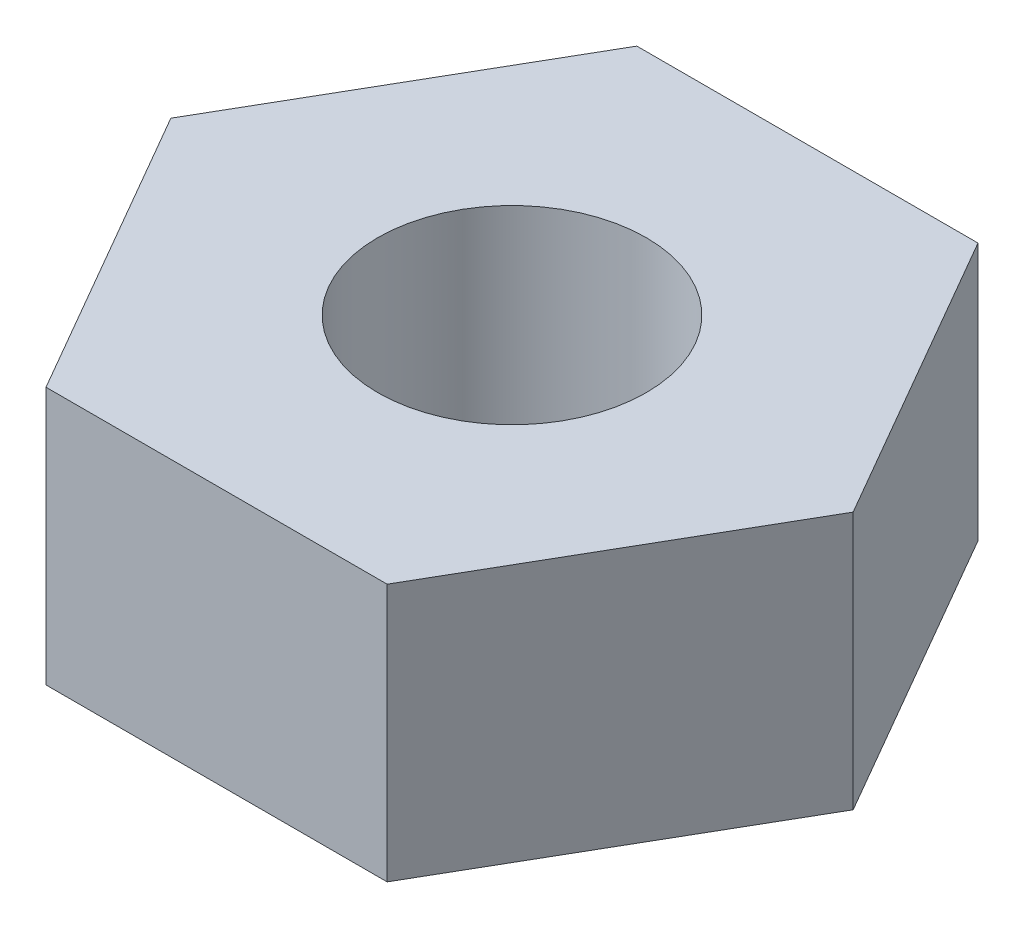
ISO-10303-21;
HEADER;
FILE_DESCRIPTION(('STEP AP214'),'2;1');
FILE_NAME('part.step','',(''),(''),'','','');
FILE_SCHEMA(('AUTOMOTIVE_DESIGN { 1 0 10303 214 1 1 1 1 }'));
ENDSEC;
DATA;
#1=APPLICATION_CONTEXT('core data for automotive mechanical design processes');
#2=APPLICATION_PROTOCOL_DEFINITION('international standard','automotive_design',2000,#1);
#3=PRODUCT_CONTEXT('',#1,'mechanical');
#4=PRODUCT('Part','Part','',(#3));
#5=PRODUCT_RELATED_PRODUCT_CATEGORY('part','',(#4));
#6=PRODUCT_DEFINITION_FORMATION('','',#4);
#7=PRODUCT_DEFINITION_CONTEXT('part definition',#1,'design');
#8=PRODUCT_DEFINITION('design','',#6,#7);
#9=PRODUCT_DEFINITION_SHAPE('','',#8);
#10=(LENGTH_UNIT() NAMED_UNIT(*) SI_UNIT(.MILLI.,.METRE.));
#11=(NAMED_UNIT(*) PLANE_ANGLE_UNIT() SI_UNIT($,.RADIAN.));
#12=(NAMED_UNIT(*) SI_UNIT($,.STERADIAN.) SOLID_ANGLE_UNIT());
#13=UNCERTAINTY_MEASURE_WITH_UNIT(LENGTH_MEASURE(1.E-05),#10,'distance_accuracy_value','');
#14=(GEOMETRIC_REPRESENTATION_CONTEXT(3) GLOBAL_UNCERTAINTY_ASSIGNED_CONTEXT((#13)) GLOBAL_UNIT_ASSIGNED_CONTEXT((#10,
#11,#12)) REPRESENTATION_CONTEXT('',''));
#15=CARTESIAN_POINT('',(0.,0.,0.));
#16=DIRECTION('',(0.,0.,1.));
#17=DIRECTION('',(1.,0.,0.));
#18=AXIS2_PLACEMENT_3D('',#15,#16,#17);
#19=CARTESIAN_POINT('',(-1.58771324027148,2.4,-2.75000000000001));
#20=DIRECTION('',(0.,1.,0.));
#21=DIRECTION('',(0.,0.,1.));
#22=AXIS2_PLACEMENT_3D('',#19,#20,#21);
#23=PLANE('',#22);
#24=DIRECTION('',(-1.,0.,0.));
#25=VECTOR('',#24,1.);
#26=CARTESIAN_POINT('',(1.58771324027146,2.4,-2.75));
#27=LINE('',#26,#25);
#28=CARTESIAN_POINT('',(1.58771324027146,2.4,-2.75));
#29=VERTEX_POINT('',#28);
#30=CARTESIAN_POINT('',(-1.58771324027148,2.4,-2.75000000000001));
#31=VERTEX_POINT('',#30);
#32=EDGE_CURVE('E140',#29,#31,#27,.T.);
#33=ORIENTED_EDGE('',*,*,#32,.T.);
#34=DIRECTION('',(-0.5,0.,0.866025403784439));
#35=VECTOR('',#34,1.);
#36=CARTESIAN_POINT('',(-1.58771324027148,2.4,-2.75000000000001));
#37=LINE('',#36,#35);
#38=CARTESIAN_POINT('',(-3.17542648054295,2.4,0.));
#39=VERTEX_POINT('',#38);
#40=EDGE_CURVE('E98',#31,#39,#37,.T.);
#41=ORIENTED_EDGE('',*,*,#40,.T.);
#42=DIRECTION('',(0.5,0.,0.866025403784438));
#43=VECTOR('',#42,1.);
#44=CARTESIAN_POINT('',(-3.17542648054295,2.4,0.));
#45=LINE('',#44,#43);
#46=CARTESIAN_POINT('',(-1.58771324027148,2.4,2.74999999999999));
#47=VERTEX_POINT('',#46);
#48=EDGE_CURVE('E111',#39,#47,#45,.T.);
#49=ORIENTED_EDGE('',*,*,#48,.T.);
#50=DIRECTION('',(1.,0.,0.));
#51=VECTOR('',#50,1.);
#52=CARTESIAN_POINT('',(-1.58771324027148,2.4,2.74999999999999));
#53=LINE('',#52,#51);
#54=CARTESIAN_POINT('',(1.58771324027147,2.4,2.74999999999999));
#55=VERTEX_POINT('',#54);
#56=EDGE_CURVE('E105',#47,#55,#53,.T.);
#57=ORIENTED_EDGE('',*,*,#56,.T.);
#58=DIRECTION('',(0.500000000000001,0.,-0.866025403784438));
#59=VECTOR('',#58,1.);
#60=CARTESIAN_POINT('',(1.58771324027147,2.4,2.74999999999999));
#61=LINE('',#60,#59);
#62=CARTESIAN_POINT('',(3.17542648054293,2.4,0.));
#63=VERTEX_POINT('',#62);
#64=EDGE_CURVE('E109',#55,#63,#61,.T.);
#65=ORIENTED_EDGE('',*,*,#64,.T.);
#66=DIRECTION('',(-0.5,0.,-0.866025403784439));
#67=VECTOR('',#66,1.);
#68=CARTESIAN_POINT('',(3.17542648054293,2.4,0.));
#69=LINE('',#68,#67);
#70=EDGE_CURVE('E61',#63,#29,#69,.T.);
#71=ORIENTED_EDGE('',*,*,#70,.T.);
#72=EDGE_LOOP('',(#33,#41,#49,#57,#65,#71));
#73=FACE_BOUND('',#72,.T.);
#74=CARTESIAN_POINT('',(0.,2.4,0.));
#75=DIRECTION('',(0.,1.,0.));
#76=DIRECTION('',(0.,0.,1.));
#77=AXIS2_PLACEMENT_3D('',#74,#75,#76);
#78=CIRCLE('',#77,1.25);
#79=CARTESIAN_POINT('',(0.,2.4,1.25));
#80=VERTEX_POINT('',#79);
#81=EDGE_CURVE('E133',#80,#80,#78,.T.);
#82=ORIENTED_EDGE('',*,*,#81,.F.);
#83=EDGE_LOOP('',(#82));
#84=FACE_BOUND('',#83,.T.);
#85=ADVANCED_FACE('F44',(#73,#84),#23,.T.);
#86=CARTESIAN_POINT('',(-1.58771324027148,0.,-2.75000000000001));
#87=DIRECTION('',(0.,1.,0.));
#88=DIRECTION('',(0.,0.,1.));
#89=AXIS2_PLACEMENT_3D('',#86,#87,#88);
#90=PLANE('',#89);
#91=DIRECTION('',(-1.,0.,0.));
#92=VECTOR('',#91,1.);
#93=CARTESIAN_POINT('',(1.58771324027146,0.,-2.75));
#94=LINE('',#93,#92);
#95=CARTESIAN_POINT('',(1.58771324027146,0.,-2.75));
#96=VERTEX_POINT('',#95);
#97=CARTESIAN_POINT('',(-1.58771324027148,0.,-2.75000000000001));
#98=VERTEX_POINT('',#97);
#99=EDGE_CURVE('E129',#96,#98,#94,.T.);
#100=ORIENTED_EDGE('',*,*,#99,.F.);
#101=DIRECTION('',(-0.5,0.,-0.866025403784439));
#102=VECTOR('',#101,1.);
#103=CARTESIAN_POINT('',(3.17542648054293,0.,0.));
#104=LINE('',#103,#102);
#105=CARTESIAN_POINT('',(3.17542648054293,0.,0.));
#106=VERTEX_POINT('',#105);
#107=EDGE_CURVE('E90',#106,#96,#104,.T.);
#108=ORIENTED_EDGE('',*,*,#107,.F.);
#109=DIRECTION('',(0.500000000000001,0.,-0.866025403784438));
#110=VECTOR('',#109,1.);
#111=CARTESIAN_POINT('',(1.58771324027147,0.,2.74999999999999));
#112=LINE('',#111,#110);
#113=CARTESIAN_POINT('',(1.58771324027147,0.,2.74999999999999));
#114=VERTEX_POINT('',#113);
#115=EDGE_CURVE('E84',#114,#106,#112,.T.);
#116=ORIENTED_EDGE('',*,*,#115,.F.);
#117=DIRECTION('',(1.,0.,0.));
#118=VECTOR('',#117,1.);
#119=CARTESIAN_POINT('',(-1.58771324027148,0.,2.74999999999999));
#120=LINE('',#119,#118);
#121=CARTESIAN_POINT('',(-1.58771324027148,0.,2.74999999999999));
#122=VERTEX_POINT('',#121);
#123=EDGE_CURVE('E119',#122,#114,#120,.T.);
#124=ORIENTED_EDGE('',*,*,#123,.F.);
#125=DIRECTION('',(0.5,0.,0.866025403784438));
#126=VECTOR('',#125,1.);
#127=CARTESIAN_POINT('',(-3.17542648054295,0.,0.));
#128=LINE('',#127,#126);
#129=CARTESIAN_POINT('',(-3.17542648054295,0.,0.));
#130=VERTEX_POINT('',#129);
#131=EDGE_CURVE('E135',#130,#122,#128,.T.);
#132=ORIENTED_EDGE('',*,*,#131,.F.);
#133=DIRECTION('',(-0.5,0.,0.866025403784439));
#134=VECTOR('',#133,1.);
#135=CARTESIAN_POINT('',(-1.58771324027148,0.,-2.75000000000001));
#136=LINE('',#135,#134);
#137=EDGE_CURVE('E132',#98,#130,#136,.T.);
#138=ORIENTED_EDGE('',*,*,#137,.F.);
#139=EDGE_LOOP('',(#100,#108,#116,#124,#132,#138));
#140=FACE_BOUND('',#139,.T.);
#141=CARTESIAN_POINT('',(0.,0.,0.));
#142=DIRECTION('',(0.,1.,0.));
#143=DIRECTION('',(0.,0.,1.));
#144=AXIS2_PLACEMENT_3D('',#141,#142,#143);
#145=CIRCLE('',#144,1.25);
#146=CARTESIAN_POINT('',(0.,0.,1.25));
#147=VERTEX_POINT('',#146);
#148=EDGE_CURVE('E233',#147,#147,#145,.T.);
#149=ORIENTED_EDGE('',*,*,#148,.T.);
#150=EDGE_LOOP('',(#149));
#151=FACE_BOUND('',#150,.T.);
#152=ADVANCED_FACE('F149',(#140,#151),#90,.F.);
#153=CARTESIAN_POINT('',(1.58771324027146,2.4,-2.75));
#154=DIRECTION('',(0.,0.,1.));
#155=DIRECTION('',(1.,0.,0.));
#156=AXIS2_PLACEMENT_3D('',#153,#154,#155);
#157=PLANE('',#156);
#158=ORIENTED_EDGE('',*,*,#99,.T.);
#159=DIRECTION('',(0.,-1.,0.));
#160=VECTOR('',#159,1.);
#161=CARTESIAN_POINT('',(-1.58771324027148,2.4,-2.75000000000001));
#162=LINE('',#161,#160);
#163=EDGE_CURVE('E13',#31,#98,#162,.T.);
#164=ORIENTED_EDGE('',*,*,#163,.F.);
#165=ORIENTED_EDGE('',*,*,#32,.F.);
#166=DIRECTION('',(0.,-1.,0.));
#167=VECTOR('',#166,1.);
#168=CARTESIAN_POINT('',(1.58771324027146,2.4,-2.75));
#169=LINE('',#168,#167);
#170=EDGE_CURVE('E125',#29,#96,#169,.T.);
#171=ORIENTED_EDGE('',*,*,#170,.T.);
#172=EDGE_LOOP('',(#158,#164,#165,#171));
#173=FACE_BOUND('',#172,.T.);
#174=ADVANCED_FACE('F46',(#173),#157,.F.);
#175=CARTESIAN_POINT('',(-1.58771324027148,2.4,-2.75000000000001));
#176=DIRECTION('',(0.866025403784439,0.,0.5));
#177=DIRECTION('',(0.5,0.,-0.866025403784439));
#178=AXIS2_PLACEMENT_3D('',#175,#176,#177);
#179=PLANE('',#178);
#180=ORIENTED_EDGE('',*,*,#137,.T.);
#181=DIRECTION('',(0.,-1.,0.));
#182=VECTOR('',#181,1.);
#183=CARTESIAN_POINT('',(-3.17542648054295,2.4,0.));
#184=LINE('',#183,#182);
#185=EDGE_CURVE('E53',#39,#130,#184,.T.);
#186=ORIENTED_EDGE('',*,*,#185,.F.);
#187=ORIENTED_EDGE('',*,*,#40,.F.);
#188=ORIENTED_EDGE('',*,*,#163,.T.);
#189=EDGE_LOOP('',(#180,#186,#187,#188));
#190=FACE_BOUND('',#189,.T.);
#191=ADVANCED_FACE('F174',(#190),#179,.F.);
#192=CARTESIAN_POINT('',(-3.17542648054295,2.4,0.));
#193=DIRECTION('',(0.866025403784438,0.,-0.5));
#194=DIRECTION('',(-0.5,0.,-0.866025403784439));
#195=AXIS2_PLACEMENT_3D('',#192,#193,#194);
#196=PLANE('',#195);
#197=ORIENTED_EDGE('',*,*,#131,.T.);
#198=DIRECTION('',(0.,-1.,0.));
#199=VECTOR('',#198,1.);
#200=CARTESIAN_POINT('',(-1.58771324027148,2.4,2.74999999999999));
#201=LINE('',#200,#199);
#202=EDGE_CURVE('E120',#47,#122,#201,.T.);
#203=ORIENTED_EDGE('',*,*,#202,.F.);
#204=ORIENTED_EDGE('',*,*,#48,.F.);
#205=ORIENTED_EDGE('',*,*,#185,.T.);
#206=EDGE_LOOP('',(#197,#203,#204,#205));
#207=FACE_BOUND('',#206,.T.);
#208=ADVANCED_FACE('F146',(#207),#196,.F.);
#209=CARTESIAN_POINT('',(-1.58771324027148,2.4,2.74999999999999));
#210=DIRECTION('',(0.,0.,-1.));
#211=DIRECTION('',(-1.,0.,0.));
#212=AXIS2_PLACEMENT_3D('',#209,#210,#211);
#213=PLANE('',#212);
#214=ORIENTED_EDGE('',*,*,#123,.T.);
#215=DIRECTION('',(0.,-1.,0.));
#216=VECTOR('',#215,1.);
#217=CARTESIAN_POINT('',(1.58771324027147,2.4,2.74999999999999));
#218=LINE('',#217,#216);
#219=EDGE_CURVE('E116',#55,#114,#218,.T.);
#220=ORIENTED_EDGE('',*,*,#219,.F.);
#221=ORIENTED_EDGE('',*,*,#56,.F.);
#222=ORIENTED_EDGE('',*,*,#202,.T.);
#223=EDGE_LOOP('',(#214,#220,#221,#222));
#224=FACE_BOUND('',#223,.T.);
#225=ADVANCED_FACE('F117',(#224),#213,.F.);
#226=CARTESIAN_POINT('',(1.58771324027147,2.4,2.74999999999999));
#227=DIRECTION('',(-0.866025403784438,0.,-0.500000000000001));
#228=DIRECTION('',(-0.500000000000001,0.,0.866025403784438));
#229=AXIS2_PLACEMENT_3D('',#226,#227,#228);
#230=PLANE('',#229);
#231=ORIENTED_EDGE('',*,*,#115,.T.);
#232=DIRECTION('',(0.,-1.,0.));
#233=VECTOR('',#232,1.);
#234=CARTESIAN_POINT('',(3.17542648054293,2.4,0.));
#235=LINE('',#234,#233);
#236=EDGE_CURVE('E121',#63,#106,#235,.T.);
#237=ORIENTED_EDGE('',*,*,#236,.F.);
#238=ORIENTED_EDGE('',*,*,#64,.F.);
#239=ORIENTED_EDGE('',*,*,#219,.T.);
#240=EDGE_LOOP('',(#231,#237,#238,#239));
#241=FACE_BOUND('',#240,.T.);
#242=ADVANCED_FACE('F123',(#241),#230,.F.);
#243=CARTESIAN_POINT('',(3.17542648054293,2.4,0.));
#244=DIRECTION('',(-0.866025403784439,0.,0.5));
#245=DIRECTION('',(0.5,0.,0.866025403784439));
#246=AXIS2_PLACEMENT_3D('',#243,#244,#245);
#247=PLANE('',#246);
#248=ORIENTED_EDGE('',*,*,#107,.T.);
#249=ORIENTED_EDGE('',*,*,#170,.F.);
#250=ORIENTED_EDGE('',*,*,#70,.F.);
#251=ORIENTED_EDGE('',*,*,#236,.T.);
#252=EDGE_LOOP('',(#248,#249,#250,#251));
#253=FACE_BOUND('',#252,.T.);
#254=ADVANCED_FACE('F154',(#253),#247,.F.);
#255=CARTESIAN_POINT('',(0.,2.4,0.));
#256=DIRECTION('',(0.,-1.,0.));
#257=DIRECTION('',(0.,0.,-1.));
#258=AXIS2_PLACEMENT_3D('',#255,#256,#257);
#259=CYLINDRICAL_SURFACE('',#258,1.25);
#260=ORIENTED_EDGE('',*,*,#81,.T.);
#261=EDGE_LOOP('',(#260));
#262=FACE_BOUND('',#261,.T.);
#263=ORIENTED_EDGE('',*,*,#148,.F.);
#264=EDGE_LOOP('',(#263));
#265=FACE_BOUND('',#264,.T.);
#266=ADVANCED_FACE('F156',(#262,#265),#259,.F.);
#267=CLOSED_SHELL('',(#85,#152,#174,#191,#208,#225,#242,#254,#266));
#268=MANIFOLD_SOLID_BREP('B2',#267);
#269=ADVANCED_BREP_SHAPE_REPRESENTATION('',(#18,#268),#14);
#270=SHAPE_DEFINITION_REPRESENTATION(#9,#269);
ENDSEC;
END-ISO-10303-21;
